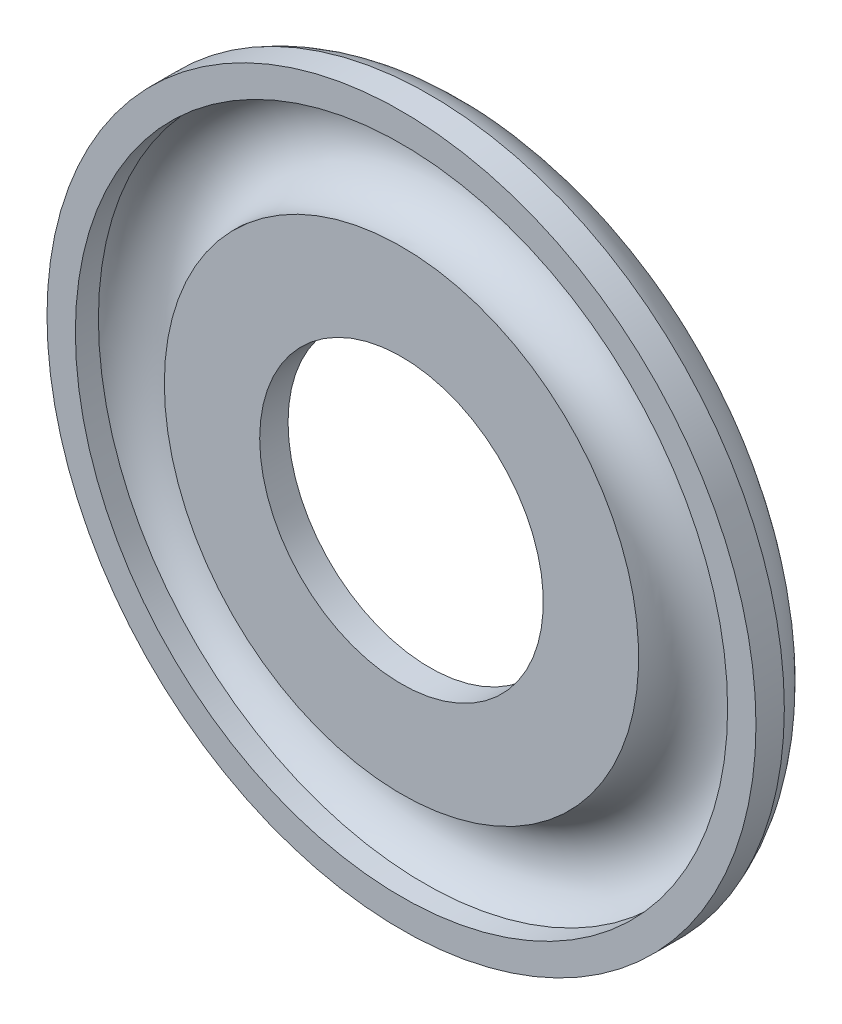
ISO-10303-21;
HEADER;
FILE_DESCRIPTION(('STEP AP214'),'2;1');
FILE_NAME('part.step','',(''),(''),'','','');
FILE_SCHEMA(('AUTOMOTIVE_DESIGN { 1 0 10303 214 1 1 1 1 }'));
ENDSEC;
DATA;
#1=APPLICATION_CONTEXT('core data for automotive mechanical design processes');
#2=APPLICATION_PROTOCOL_DEFINITION('international standard','automotive_design',2000,#1);
#3=PRODUCT_CONTEXT('',#1,'mechanical');
#4=PRODUCT('Part','Part','',(#3));
#5=PRODUCT_RELATED_PRODUCT_CATEGORY('part','',(#4));
#6=PRODUCT_DEFINITION_FORMATION('','',#4);
#7=PRODUCT_DEFINITION_CONTEXT('part definition',#1,'design');
#8=PRODUCT_DEFINITION('design','',#6,#7);
#9=PRODUCT_DEFINITION_SHAPE('','',#8);
#10=(LENGTH_UNIT() NAMED_UNIT(*) SI_UNIT(.MILLI.,.METRE.));
#11=(NAMED_UNIT(*) PLANE_ANGLE_UNIT() SI_UNIT($,.RADIAN.));
#12=(NAMED_UNIT(*) SI_UNIT($,.STERADIAN.) SOLID_ANGLE_UNIT());
#13=UNCERTAINTY_MEASURE_WITH_UNIT(LENGTH_MEASURE(1.E-05),#10,'distance_accuracy_value','');
#14=(GEOMETRIC_REPRESENTATION_CONTEXT(3) GLOBAL_UNCERTAINTY_ASSIGNED_CONTEXT((#13)) GLOBAL_UNIT_ASSIGNED_CONTEXT((#10,
#11,#12)) REPRESENTATION_CONTEXT('',''));
#15=CARTESIAN_POINT('',(0.,0.,0.));
#16=DIRECTION('',(0.,0.,1.));
#17=DIRECTION('',(1.,0.,0.));
#18=AXIS2_PLACEMENT_3D('',#15,#16,#17);
#19=CARTESIAN_POINT('',(0.,0.,1.));
#20=DIRECTION('',(0.,0.,-1.));
#21=DIRECTION('',(-1.,0.,0.));
#22=AXIS2_PLACEMENT_3D('',#19,#20,#21);
#23=CYLINDRICAL_SURFACE('',#22,12.5);
#24=CARTESIAN_POINT('',(0.,0.,1.));
#25=DIRECTION('',(0.,0.,1.));
#26=DIRECTION('',(1.,0.,0.));
#27=AXIS2_PLACEMENT_3D('',#24,#25,#26);
#28=CIRCLE('',#27,12.5);
#29=CARTESIAN_POINT('',(12.5,0.,1.));
#30=VERTEX_POINT('',#29);
#31=EDGE_CURVE('E11',#30,#30,#28,.T.);
#32=ORIENTED_EDGE('',*,*,#31,.F.);
#33=EDGE_LOOP('',(#32));
#34=FACE_BOUND('',#33,.T.);
#35=CARTESIAN_POINT('',(0.,0.,0.));
#36=DIRECTION('',(0.,0.,1.));
#37=DIRECTION('',(1.,0.,0.));
#38=AXIS2_PLACEMENT_3D('',#35,#36,#37);
#39=CIRCLE('',#38,12.5);
#40=CARTESIAN_POINT('',(-12.5,0.,0.));
#41=VERTEX_POINT('',#40);
#42=EDGE_CURVE('E44',#41,#41,#39,.T.);
#43=ORIENTED_EDGE('',*,*,#42,.T.);
#44=EDGE_LOOP('',(#43));
#45=FACE_BOUND('',#44,.T.);
#46=ADVANCED_FACE('F41',(#34,#45),#23,.T.);
#47=CARTESIAN_POINT('',(0.,0.,1.));
#48=DIRECTION('',(0.,0.,1.));
#49=DIRECTION('',(1.,0.,0.));
#50=AXIS2_PLACEMENT_3D('',#47,#48,#49);
#51=PLANE('',#50);
#52=CARTESIAN_POINT('',(0.,0.,1.));
#53=DIRECTION('',(0.,0.,1.));
#54=DIRECTION('',(1.,0.,0.));
#55=AXIS2_PLACEMENT_3D('',#52,#53,#54);
#56=CIRCLE('',#55,11.5);
#57=CARTESIAN_POINT('',(11.5,0.,1.));
#58=VERTEX_POINT('',#57);
#59=EDGE_CURVE('E75',#58,#58,#56,.T.);
#60=ORIENTED_EDGE('',*,*,#59,.F.);
#61=EDGE_LOOP('',(#60));
#62=FACE_BOUND('',#61,.T.);
#63=ORIENTED_EDGE('',*,*,#31,.T.);
#64=EDGE_LOOP('',(#63));
#65=FACE_BOUND('',#64,.T.);
#66=ADVANCED_FACE('F92',(#62,#65),#51,.T.);
#67=CARTESIAN_POINT('',(0.,0.,0.859243359702411));
#68=DIRECTION('',(0.,0.,-1.));
#69=DIRECTION('',(-1.,0.,0.));
#70=AXIS2_PLACEMENT_3D('',#67,#68,#69);
#71=TOROIDAL_SURFACE('',#70,10.,2.64353913366016);
#72=CARTESIAN_POINT('',(-10.,0.,0.859243359702411));
#73=DIRECTION('',(0.,1.,0.));
#74=DIRECTION('',(0.,0.,-1.));
#75=AXIS2_PLACEMENT_3D('',#72,#73,#74);
#76=CIRCLE('',#75,2.64353913366016);
#77=CARTESIAN_POINT('',(-7.5,0.,0.));
#78=VERTEX_POINT('',#77);
#79=EDGE_CURVE('E55',#78,#41,#76,.T.);
#80=ORIENTED_EDGE('',*,*,#79,.F.);
#81=CARTESIAN_POINT('',(0.,0.,0.));
#82=DIRECTION('',(0.,0.,-1.));
#83=DIRECTION('',(-1.,0.,0.));
#84=AXIS2_PLACEMENT_3D('',#81,#82,#83);
#85=CIRCLE('',#84,7.5);
#86=EDGE_CURVE('E84',#78,#78,#85,.T.);
#87=ORIENTED_EDGE('',*,*,#86,.F.);
#88=ORIENTED_EDGE('',*,*,#79,.T.);
#89=ORIENTED_EDGE('',*,*,#42,.F.);
#90=EDGE_LOOP('',(#80,#87,#88,#89));
#91=FACE_BOUND('',#90,.T.);
#92=ADVANCED_FACE('F89',(#91),#71,.T.);
#93=CARTESIAN_POINT('',(0.,0.,0.));
#94=DIRECTION('',(0.,0.,1.));
#95=DIRECTION('',(1.,0.,0.));
#96=AXIS2_PLACEMENT_3D('',#93,#94,#95);
#97=PLANE('',#96);
#98=CARTESIAN_POINT('',(0.,0.,0.));
#99=DIRECTION('',(0.,0.,1.));
#100=DIRECTION('',(1.,0.,0.));
#101=AXIS2_PLACEMENT_3D('',#98,#99,#100);
#102=CIRCLE('',#101,5.);
#103=CARTESIAN_POINT('',(5.,0.,0.));
#104=VERTEX_POINT('',#103);
#105=EDGE_CURVE('E71',#104,#104,#102,.T.);
#106=ORIENTED_EDGE('',*,*,#105,.T.);
#107=EDGE_LOOP('',(#106));
#108=FACE_BOUND('',#107,.T.);
#109=ORIENTED_EDGE('',*,*,#86,.T.);
#110=EDGE_LOOP('',(#109));
#111=FACE_BOUND('',#110,.T.);
#112=ADVANCED_FACE('F91',(#108,#111),#97,.F.);
#113=CARTESIAN_POINT('',(0.,0.,1.));
#114=DIRECTION('',(0.,0.,-1.));
#115=DIRECTION('',(-1.,0.,0.));
#116=AXIS2_PLACEMENT_3D('',#113,#114,#115);
#117=CYLINDRICAL_SURFACE('',#116,11.5);
#118=ORIENTED_EDGE('',*,*,#59,.T.);
#119=EDGE_LOOP('',(#118));
#120=FACE_BOUND('',#119,.T.);
#121=CARTESIAN_POINT('',(0.,0.,0.187513589726142));
#122=DIRECTION('',(0.,0.,1.));
#123=DIRECTION('',(1.,0.,0.));
#124=AXIS2_PLACEMENT_3D('',#121,#122,#123);
#125=CIRCLE('',#124,11.5);
#126=CARTESIAN_POINT('',(-11.5,0.,0.187513589726142));
#127=VERTEX_POINT('',#126);
#128=EDGE_CURVE('E68',#127,#127,#125,.T.);
#129=ORIENTED_EDGE('',*,*,#128,.F.);
#130=EDGE_LOOP('',(#129));
#131=FACE_BOUND('',#130,.T.);
#132=ADVANCED_FACE('F74',(#120,#131),#117,.F.);
#133=CARTESIAN_POINT('',(0.,0.,0.859243359702411));
#134=DIRECTION('',(0.,0.,-1.));
#135=DIRECTION('',(-1.,0.,0.));
#136=AXIS2_PLACEMENT_3D('',#133,#134,#135);
#137=TOROIDAL_SURFACE('',#136,10.,1.64353913366016);
#138=CARTESIAN_POINT('',(-10.,0.,0.859243359702411));
#139=DIRECTION('',(0.,-1.,0.));
#140=DIRECTION('',(0.,0.,-1.));
#141=AXIS2_PLACEMENT_3D('',#138,#139,#140);
#142=CIRCLE('',#141,1.64353913366016);
#143=CARTESIAN_POINT('',(-8.36249932760792,0.,1.));
#144=VERTEX_POINT('',#143);
#145=EDGE_CURVE('E65',#144,#127,#142,.F.);
#146=ORIENTED_EDGE('',*,*,#145,.T.);
#147=ORIENTED_EDGE('',*,*,#128,.T.);
#148=ORIENTED_EDGE('',*,*,#145,.F.);
#149=CARTESIAN_POINT('',(0.,0.,1.));
#150=DIRECTION('',(0.,0.,-1.));
#151=DIRECTION('',(-1.,0.,0.));
#152=AXIS2_PLACEMENT_3D('',#149,#150,#151);
#153=CIRCLE('',#152,8.36249932760792);
#154=EDGE_CURVE('E70',#144,#144,#153,.T.);
#155=ORIENTED_EDGE('',*,*,#154,.T.);
#156=EDGE_LOOP('',(#146,#147,#148,#155));
#157=FACE_BOUND('',#156,.T.);
#158=ADVANCED_FACE('F67',(#157),#137,.F.);
#159=CARTESIAN_POINT('',(0.,0.,1.));
#160=DIRECTION('',(0.,0.,1.));
#161=DIRECTION('',(1.,0.,0.));
#162=AXIS2_PLACEMENT_3D('',#159,#160,#161);
#163=PLANE('',#162);
#164=CARTESIAN_POINT('',(0.,0.,1.));
#165=DIRECTION('',(0.,0.,-1.));
#166=DIRECTION('',(-1.,0.,0.));
#167=AXIS2_PLACEMENT_3D('',#164,#165,#166);
#168=CIRCLE('',#167,5.);
#169=CARTESIAN_POINT('',(-5.,0.,1.));
#170=VERTEX_POINT('',#169);
#171=EDGE_CURVE('E166',#170,#170,#168,.T.);
#172=ORIENTED_EDGE('',*,*,#171,.T.);
#173=EDGE_LOOP('',(#172));
#174=FACE_BOUND('',#173,.T.);
#175=ORIENTED_EDGE('',*,*,#154,.F.);
#176=EDGE_LOOP('',(#175));
#177=FACE_BOUND('',#176,.T.);
#178=ADVANCED_FACE('F142',(#174,#177),#163,.T.);
#179=CARTESIAN_POINT('',(0.,0.,1.));
#180=DIRECTION('',(0.,0.,-1.));
#181=DIRECTION('',(-1.,0.,0.));
#182=AXIS2_PLACEMENT_3D('',#179,#180,#181);
#183=CYLINDRICAL_SURFACE('',#182,5.);
#184=ORIENTED_EDGE('',*,*,#171,.F.);
#185=EDGE_LOOP('',(#184));
#186=FACE_BOUND('',#185,.T.);
#187=ORIENTED_EDGE('',*,*,#105,.F.);
#188=EDGE_LOOP('',(#187));
#189=FACE_BOUND('',#188,.T.);
#190=ADVANCED_FACE('F151',(#186,#189),#183,.F.);
#191=CLOSED_SHELL('',(#46,#66,#92,#112,#132,#158,#178,#190));
#192=MANIFOLD_SOLID_BREP('B2',#191);
#193=ADVANCED_BREP_SHAPE_REPRESENTATION('',(#18,#192),#14);
#194=SHAPE_DEFINITION_REPRESENTATION(#9,#193);
ENDSEC;
END-ISO-10303-21;
